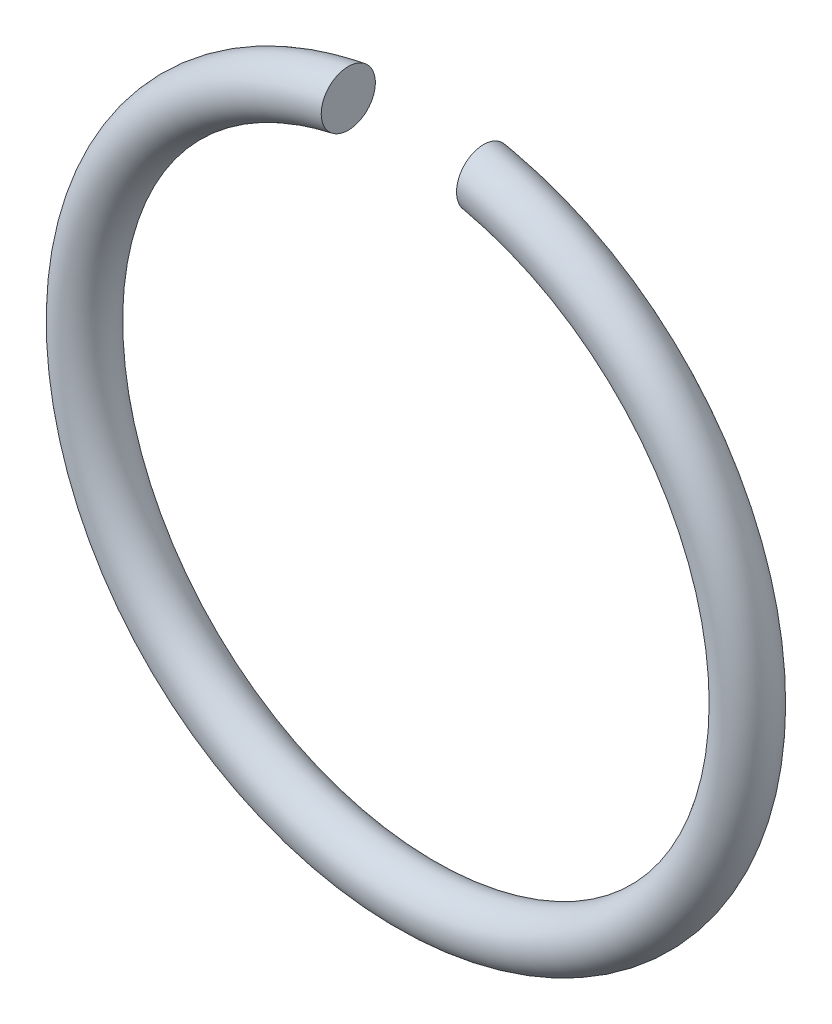
ISO-10303-21;
HEADER;
FILE_DESCRIPTION(('STEP AP214'),'2;1');
FILE_NAME('part.step','',(''),(''),'','','');
FILE_SCHEMA(('AUTOMOTIVE_DESIGN { 1 0 10303 214 1 1 1 1 }'));
ENDSEC;
DATA;
#1=APPLICATION_CONTEXT('core data for automotive mechanical design processes');
#2=APPLICATION_PROTOCOL_DEFINITION('international standard','automotive_design',2000,#1);
#3=PRODUCT_CONTEXT('',#1,'mechanical');
#4=PRODUCT('Part','Part','',(#3));
#5=PRODUCT_RELATED_PRODUCT_CATEGORY('part','',(#4));
#6=PRODUCT_DEFINITION_FORMATION('','',#4);
#7=PRODUCT_DEFINITION_CONTEXT('part definition',#1,'design');
#8=PRODUCT_DEFINITION('design','',#6,#7);
#9=PRODUCT_DEFINITION_SHAPE('','',#8);
#10=(LENGTH_UNIT() NAMED_UNIT(*) SI_UNIT(.MILLI.,.METRE.));
#11=(NAMED_UNIT(*) PLANE_ANGLE_UNIT() SI_UNIT($,.RADIAN.));
#12=(NAMED_UNIT(*) SI_UNIT($,.STERADIAN.) SOLID_ANGLE_UNIT());
#13=UNCERTAINTY_MEASURE_WITH_UNIT(LENGTH_MEASURE(1.E-05),#10,'distance_accuracy_value','');
#14=(GEOMETRIC_REPRESENTATION_CONTEXT(3) GLOBAL_UNCERTAINTY_ASSIGNED_CONTEXT((#13)) GLOBAL_UNIT_ASSIGNED_CONTEXT((#10,
#11,#12)) REPRESENTATION_CONTEXT('',''));
#15=CARTESIAN_POINT('',(0.,0.,0.));
#16=DIRECTION('',(0.,0.,1.));
#17=DIRECTION('',(1.,0.,0.));
#18=AXIS2_PLACEMENT_3D('',#15,#16,#17);
#19=CARTESIAN_POINT('',(0.,0.,0.));
#20=DIRECTION('',(0.,0.,-1.));
#21=DIRECTION('',(-1.,0.,0.));
#22=AXIS2_PLACEMENT_3D('',#19,#20,#21);
#23=TOROIDAL_SURFACE('',#22,4.9,0.4);
#24=CARTESIAN_POINT('',(1.,4.45379176900136,-0.218076556048884));
#25=CARTESIAN_POINT('',(1.,4.46646340492635,-0.237085726058224));
#26=CARTESIAN_POINT('',(1.,4.48078018226883,-0.255021182788596));
#27=CARTESIAN_POINT('',(1.,4.51224956479198,-0.28823387757235));
#28=CARTESIAN_POINT('',(1.,4.529406380042,-0.303507099070307));
#29=CARTESIAN_POINT('',(1.,4.56600261018011,-0.330955725873559));
#30=CARTESIAN_POINT('',(1.,4.58543870207209,-0.343135560987267));
#31=CARTESIAN_POINT('',(1.,4.62604735076628,-0.364114971369831));
#32=CARTESIAN_POINT('',(1.,4.64721945499758,-0.372915424250461));
#33=CARTESIAN_POINT('',(1.,4.69106679272838,-0.38703763757162));
#34=CARTESIAN_POINT('',(1.,4.71376058786229,-0.392301796714281));
#35=CARTESIAN_POINT('',(1.,4.75970902507223,-0.398990172444303));
#36=CARTESIAN_POINT('',(1.,4.78296373519118,-0.4004139207751));
#37=CARTESIAN_POINT('',(1.,4.82963083874837,-0.399373317307921));
#38=CARTESIAN_POINT('',(1.,4.85304233869439,-0.396868157792582));
#39=CARTESIAN_POINT('',(1.,4.89910945017516,-0.387948382452414));
#40=CARTESIAN_POINT('',(1.,4.92176506322154,-0.38153377444628));
#41=CARTESIAN_POINT('',(1.,4.96557697030154,-0.364984996642279));
#42=CARTESIAN_POINT('',(1.,4.98673866556586,-0.354865141769099));
#43=CARTESIAN_POINT('',(1.,5.02702717081894,-0.331164419682772));
#44=CARTESIAN_POINT('',(1.,5.04615413108025,-0.317583808310897));
#45=CARTESIAN_POINT('',(1.,5.08151800993622,-0.287558126320064));
#46=CARTESIAN_POINT('',(1.,5.09779389824376,-0.27115896901468));
#47=CARTESIAN_POINT('',(1.,5.12729657721609,-0.235814705902981));
#48=CARTESIAN_POINT('',(1.,5.14052368893679,-0.216869868506157));
#49=CARTESIAN_POINT('',(1.,5.16328890661271,-0.177358332619518));
#50=CARTESIAN_POINT('',(1.,5.17289215539446,-0.156829161301217));
#51=CARTESIAN_POINT('',(1.,5.18845459287659,-0.114433217789715));
#52=CARTESIAN_POINT('',(1.,5.19441413123294,-0.0925665741639796));
#53=CARTESIAN_POINT('',(1.,5.20243617091637,-0.0484758304221467));
#54=CARTESIAN_POINT('',(1.,5.20455681613914,-0.0262622944810002));
#55=CARTESIAN_POINT('',(1.,5.20501278942563,0.0182030476798317));
#56=CARTESIAN_POINT('',(1.,5.20334830682031,0.0404548519297161));
#57=CARTESIAN_POINT('',(1.,5.19630905780047,0.0842202841670877));
#58=CARTESIAN_POINT('',(1.,5.19095745349634,0.105737645165694));
#59=CARTESIAN_POINT('',(1.,5.17673411733545,0.147574704645199));
#60=CARTESIAN_POINT('',(1.,5.16786235828275,0.167894393871762));
#61=CARTESIAN_POINT('',(1.,5.14681853953295,0.206868876086264));
#62=CARTESIAN_POINT('',(1.,5.13463113140228,0.225515376160201));
#63=CARTESIAN_POINT('',(1.,5.1073391016167,0.260533628882143));
#64=CARTESIAN_POINT('',(1.,5.09223430565791,0.276905245513151));
#65=CARTESIAN_POINT('',(1.,5.05931628812918,0.307158880602186));
#66=CARTESIAN_POINT('',(1.,5.0414681815176,0.321002929170315));
#67=CARTESIAN_POINT('',(1.,5.0037362846174,0.345562322310037));
#68=CARTESIAN_POINT('',(1.,4.98385230668194,0.356277378130225));
#69=CARTESIAN_POINT('',(1.,4.94221940144435,0.37448453056868));
#70=CARTESIAN_POINT('',(1.,4.9204427397716,0.381913213015819));
#71=CARTESIAN_POINT('',(1.,4.87596205372194,0.393075038512626));
#72=CARTESIAN_POINT('',(1.,4.8532579402272,0.396807825553882));
#73=CARTESIAN_POINT('',(1.,4.80717068828077,0.400523838157488));
#74=CARTESIAN_POINT('',(1.,4.78378251615478,0.400444818034545));
#75=CARTESIAN_POINT('',(1.,4.73734539008063,0.396391160644215));
#76=CARTESIAN_POINT('',(1.,4.71429645673489,0.39241628775942));
#77=CARTESIAN_POINT('',(1.,4.66902722525848,0.380633126697482));
#78=CARTESIAN_POINT('',(1.,4.64681380648998,0.372798365179611));
#79=CARTESIAN_POINT('',(1.,4.60403013971732,0.353485135081821));
#80=CARTESIAN_POINT('',(1.,4.58345987358664,0.342006706704179));
#81=CARTESIAN_POINT('',(1.,4.5447168623394,0.315801253871824));
#82=CARTESIAN_POINT('',(1.,4.52652805578694,0.301097996258073));
#83=CARTESIAN_POINT('',(1.,4.49293910514161,0.268790404500007));
#84=CARTESIAN_POINT('',(1.,4.47753867678624,0.251186366426989));
#85=CARTESIAN_POINT('',(1.,4.45029870752249,0.2139449605037));
#86=CARTESIAN_POINT('',(1.,4.43839464284633,0.194354805692346));
#87=CARTESIAN_POINT('',(1.,4.41813717222451,0.153418183250455));
#88=CARTESIAN_POINT('',(1.,4.40978309781959,0.132072047173601));
#89=CARTESIAN_POINT('',(1.,4.39706197617738,0.0887718798412546));
#90=CARTESIAN_POINT('',(1.,4.39260537487419,0.0668441347397379));
#91=CARTESIAN_POINT('',(1.,4.38749700873444,0.0225441265649492));
#92=CARTESIAN_POINT('',(1.,4.38684584401581,0.000171793938317276));
#93=CARTESIAN_POINT('',(1.,4.38935282171203,-0.044036530848253));
#94=CARTESIAN_POINT('',(1.,4.39245716315476,-0.0658756320228684));
#95=CARTESIAN_POINT('',(1.,4.40228174487141,-0.108704089475585));
#96=CARTESIAN_POINT('',(1.,4.40899742702229,-0.129694481138105));
#97=CARTESIAN_POINT('',(1.,4.42234003405132,-0.161877333978837));
#98=CARTESIAN_POINT('',(1.,4.42786159143949,-0.173540809261487));
#99=CARTESIAN_POINT('',(1.,4.44001133154457,-0.196275723174183));
#100=CARTESIAN_POINT('',(1.,4.44663949288239,-0.207347173236436));
#101=CARTESIAN_POINT('',(1.,4.45379176900136,-0.218076556048884));
#102=B_SPLINE_CURVE_WITH_KNOTS('',3,(#24,#25,#26,#27,#28,#29,#30,#31,#32,#33,#34,#35,#36,#37,
#38,#39,#40,#41,#42,#43,#44,#45,#46,#47,#48,#49,#50,#51,#52,#53,#54,#55,#56,#57,#58,#59,#60,#61,
#62,#63,#64,#65,#66,#67,#68,#69,#70,#71,#72,#73,#74,#75,#76,#77,#78,#79,#80,#81,#82,#83,#84,#85,
#86,#87,#88,#89,#90,#91,#92,#93,#94,#95,#96,#97,#98,#99,#100,#101),.UNSPECIFIED.,.T.,.F.,(4,2,2,
2,2,2,2,2,2,2,2,2,2,2,2,2,2,2,2,2,2,2,2,2,2,2,2,2,2,2,2,2,2,2,2,2,2,2,4),(0.,0.0684882227454774,
0.137078896812064,0.205570786300522,0.274044876676168,0.343608893699751,0.413181392194984,
0.483481306763086,0.553781080735476,0.62381207463905,0.693837892904405,0.762815661626233,
0.831786163220677,0.899449975499822,0.96710729363744,1.03373101569437,1.10035140532572,
1.16655706349808,1.23276323317042,1.29928125097497,1.36580324423223,1.43325443921838,
1.50071185680662,1.56941951387705,1.63813378859278,1.70797052111454,1.77781147755497,
1.84813825567234,1.91846425786852,1.98828840651783,2.05810543289915,2.12653876234907,
2.19495920016236,2.26176276139408,2.32857685727312,2.39444501104393,2.46023022252588,
2.49888791010295,2.53754485091727),.UNSPECIFIED.);
#103=CARTESIAN_POINT('',(1.,4.45379176900136,-0.218076556048884));
#104=VERTEX_POINT('',#103);
#105=EDGE_CURVE('E45',#104,#104,#102,.T.);
#106=ORIENTED_EDGE('',*,*,#105,.T.);
#107=EDGE_LOOP('',(#106));
#108=FACE_BOUND('',#107,.T.);
#109=CARTESIAN_POINT('',(-1.,4.45379176900136,-0.218076556048884));
#110=CARTESIAN_POINT('',(-1.,4.44152464986608,-0.199670650443615));
#111=CARTESIAN_POINT('',(-1.,4.43078180485696,-0.18023212150711));
#112=CARTESIAN_POINT('',(-1.,4.41269226485008,-0.139817280950541));
#113=CARTESIAN_POINT('',(-1.,4.40534874090742,-0.118839554535019));
#114=CARTESIAN_POINT('',(-1.,4.39430515933085,-0.0759387868342526));
#115=CARTESIAN_POINT('',(-1.,4.39060577856533,-0.0540155707214096));
#116=CARTESIAN_POINT('',(-1.,4.38697855485385,-0.00986403556837718));
#117=CARTESIAN_POINT('',(-1.,4.38704986351734,0.0123642137153101));
#118=CARTESIAN_POINT('',(-1.,4.3909418979927,0.0562947146929842));
#119=CARTESIAN_POINT('',(-1.,4.39473013699263,0.0779998549377703));
#120=CARTESIAN_POINT('',(-1.,4.40588366855219,0.120470081423213));
#121=CARTESIAN_POINT('',(-1.,4.41324907418361,0.141235137925784));
#122=CARTESIAN_POINT('',(-1.,4.43135707980327,0.181332045870033));
#123=CARTESIAN_POINT('',(-1.,4.44211271186642,0.200658004926151));
#124=CARTESIAN_POINT('',(-1.,4.46665962372214,0.23727349132986));
#125=CARTESIAN_POINT('',(-1.,4.48045114788815,0.254562854570055));
#126=CARTESIAN_POINT('',(-1.,4.51094449497517,0.286962923261789));
#127=CARTESIAN_POINT('',(-1.,4.52769554533253,0.302027280472854));
#128=CARTESIAN_POINT('',(-1.,4.56343913649485,0.329207373652753));
#129=CARTESIAN_POINT('',(-1.,4.58243194212058,0.341322760738121));
#130=CARTESIAN_POINT('',(-1.,4.62259606442738,0.362555446502462));
#131=CARTESIAN_POINT('',(-1.,4.64380789353163,0.371596135628972));
#132=CARTESIAN_POINT('',(-1.,4.68743220603976,0.386056130009366));
#133=CARTESIAN_POINT('',(-1.,4.70984481344762,0.391475060463787));
#134=CARTESIAN_POINT('',(-1.,4.75564318881268,0.39861580361738));
#135=CARTESIAN_POINT('',(-1.,4.77903902268825,0.400273209672405));
#136=CARTESIAN_POINT('',(-1.,4.82577942156226,0.399653376452277));
#137=CARTESIAN_POINT('',(-1.,4.84912398442066,0.397375975949974));
#138=CARTESIAN_POINT('',(-1.,4.89518651875532,0.388919826012656));
#139=CARTESIAN_POINT('',(-1.,4.91790185053152,0.382726664382441));
#140=CARTESIAN_POINT('',(-1.,4.96195429161702,0.366577463164202));
#141=CARTESIAN_POINT('',(-1.,4.9832914511018,0.356621560657758));
#142=CARTESIAN_POINT('',(-1.,5.02375004939654,0.33332083210151));
#143=CARTESIAN_POINT('',(-1.,5.04289115203104,0.320010171638956));
#144=CARTESIAN_POINT('',(-1.,5.07861480471256,0.290310052154913));
#145=CARTESIAN_POINT('',(-1.,5.09519759484825,0.273920882361259));
#146=CARTESIAN_POINT('',(-1.,5.1250152172291,0.238840599318896));
#147=CARTESIAN_POINT('',(-1.,5.13830451733378,0.220195787727047));
#148=CARTESIAN_POINT('',(-1.,5.16149631123512,0.18090663830206));
#149=CARTESIAN_POINT('',(-1.,5.17139916659852,0.160262514235387));
#150=CARTESIAN_POINT('',(-1.,5.18735435301083,0.117963221800812));
#151=CARTESIAN_POINT('',(-1.,5.19347305008122,0.0963330741765135));
#152=CARTESIAN_POINT('',(-1.,5.201944966307,0.0523478169071463));
#153=CARTESIAN_POINT('',(-1.,5.20429847608877,0.0299927633518583));
#154=CARTESIAN_POINT('',(-1.,5.20516039622027,-0.0145335829445733));
#155=CARTESIAN_POINT('',(-1.,5.20371262261902,-0.0367040404272157));
#156=CARTESIAN_POINT('',(-1.,5.19711046972958,-0.0804852709720332));
#157=CARTESIAN_POINT('',(-1.,5.1919561747641,-0.102096056755052));
#158=CARTESIAN_POINT('',(-1.,5.17810871163085,-0.144125367739932));
#159=CARTESIAN_POINT('',(-1.,5.16941935337984,-0.164545149541967));
#160=CARTESIAN_POINT('',(-1.,5.14876682394525,-0.203654836198255));
#161=CARTESIAN_POINT('',(-1.,5.13680354494361,-0.222344684054502));
#162=CARTESIAN_POINT('',(-1.,5.10983080485054,-0.257660756982809));
#163=CARTESIAN_POINT('',(-1.,5.09479351861297,-0.274265719961333));
#164=CARTESIAN_POINT('',(-1.,5.06218601733539,-0.304766611470601));
#165=CARTESIAN_POINT('',(-1.,5.04461559989047,-0.318662323314997));
#166=CARTESIAN_POINT('',(-1.,5.00712653043907,-0.343603035977894));
#167=CARTESIAN_POINT('',(-1.,4.98717328282859,-0.354596025843468));
#168=CARTESIAN_POINT('',(-1.,4.94572911356019,-0.373145667037664));
#169=CARTESIAN_POINT('',(-1.,4.92423803835938,-0.380701974678492));
#170=CARTESIAN_POINT('',(-1.,4.87990429448895,-0.392305177629877));
#171=CARTESIAN_POINT('',(-1.,4.85704401358291,-0.396284813415877));
#172=CARTESIAN_POINT('',(-1.,4.8109804854986,-0.400402756025548));
#173=CARTESIAN_POINT('',(-1.,4.78777722214157,-0.400540881059849));
#174=CARTESIAN_POINT('',(-1.,4.74137475097203,-0.396956677046477));
#175=CARTESIAN_POINT('',(-1.,4.71817929755894,-0.39318555621985));
#176=CARTESIAN_POINT('',(-1.,4.67274211796,-0.381804902322358));
#177=CARTESIAN_POINT('',(-1.,4.65050065459679,-0.374194318762546));
#178=CARTESIAN_POINT('',(-1.,4.6075967429367,-0.355321744569489));
#179=CARTESIAN_POINT('',(-1.,4.58693602278985,-0.344055826283513));
#180=CARTESIAN_POINT('',(-1.,4.54785294933968,-0.318176093053226));
#181=CARTESIAN_POINT('',(-1.,4.52942783779081,-0.303566469111104));
#182=CARTESIAN_POINT('',(-1.,4.50137165247414,-0.277070668275273));
#183=CARTESIAN_POINT('',(-1.,4.49092646048279,-0.266033198768994));
#184=CARTESIAN_POINT('',(-1.,4.47134552043503,-0.242851415274312));
#185=CARTESIAN_POINT('',(-1.,4.462209752489,-0.230707118102743));
#186=CARTESIAN_POINT('',(-1.,4.45379176900136,-0.218076556048884));
#187=B_SPLINE_CURVE_WITH_KNOTS('',3,(#109,#110,#111,#112,#113,#114,#115,#116,#117,#118,#119,
#120,#121,#122,#123,#124,#125,#126,#127,#128,#129,#130,#131,#132,#133,#134,#135,#136,#137,#138,
#139,#140,#141,#142,#143,#144,#145,#146,#147,#148,#149,#150,#151,#152,#153,#154,#155,#156,#157,
#158,#159,#160,#161,#162,#163,#164,#165,#166,#167,#168,#169,#170,#171,#172,#173,#174,#175,#176,
#177,#178,#179,#180,#181,#182,#183,#184,#185,#186),.UNSPECIFIED.,.T.,.F.,(4,2,2,2,2,2,2,2,2,2,2,
2,2,2,2,2,2,2,2,2,2,2,2,2,2,2,2,2,2,2,2,2,2,2,2,2,2,2,4),(0.,0.0663035635655386,
0.13266885435073,0.199046469597587,0.265409150201241,0.33119692630896,0.396986782058575,
0.463032684062758,0.529083904361992,0.596360019371525,0.663644089744249,0.732499216852319,
0.801361468363959,0.87139419312879,0.941429787525003,1.01172466473978,1.08201698126691,
1.15162047287315,1.22121742845652,1.28957231926326,1.35791990961771,1.42503205635526,
1.49213902260635,1.55847587565301,1.62481121959591,1.69107525918006,1.75734148126061,
1.82423643562264,1.89113673806126,1.95916493879566,2.02719994124244,2.09648908818947,
2.16578151405717,2.23594932223767,2.30613633896906,2.37639902271172,2.4465741168503,
2.49207386101079,2.53757291397598),.UNSPECIFIED.);
#188=CARTESIAN_POINT('',(-1.,4.45379176900136,-0.218076556048884));
#189=VERTEX_POINT('',#188);
#190=EDGE_CURVE('E10',#189,#189,#187,.T.);
#191=ORIENTED_EDGE('',*,*,#190,.T.);
#192=EDGE_LOOP('',(#191));
#193=FACE_BOUND('',#192,.T.);
#194=ADVANCED_FACE('F35',(#108,#193),#23,.T.);
#195=CARTESIAN_POINT('',(1.,0.,-0.4));
#196=DIRECTION('',(1.,0.,0.));
#197=DIRECTION('',(0.,0.,-1.));
#198=AXIS2_PLACEMENT_3D('',#195,#196,#197);
#199=PLANE('',#198);
#200=ORIENTED_EDGE('',*,*,#105,.F.);
#201=EDGE_LOOP('',(#200));
#202=FACE_BOUND('',#201,.T.);
#203=ADVANCED_FACE('F55',(#202),#199,.F.);
#204=CARTESIAN_POINT('',(-1.,0.,-0.4));
#205=DIRECTION('',(-1.,0.,0.));
#206=DIRECTION('',(0.,0.,1.));
#207=AXIS2_PLACEMENT_3D('',#204,#205,#206);
#208=PLANE('',#207);
#209=ORIENTED_EDGE('',*,*,#190,.F.);
#210=EDGE_LOOP('',(#209));
#211=FACE_BOUND('',#210,.T.);
#212=ADVANCED_FACE('F58',(#211),#208,.F.);
#213=CLOSED_SHELL('',(#194,#203,#212));
#214=MANIFOLD_SOLID_BREP('B2',#213);
#215=ADVANCED_BREP_SHAPE_REPRESENTATION('',(#18,#214),#14);
#216=SHAPE_DEFINITION_REPRESENTATION(#9,#215);
ENDSEC;
END-ISO-10303-21;
